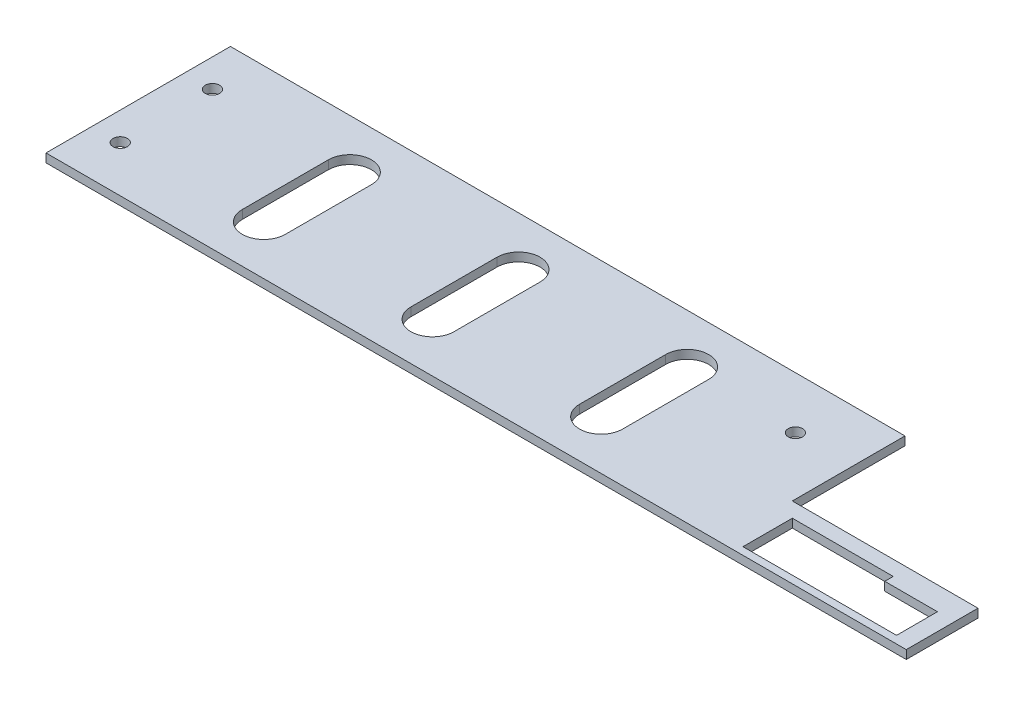
ISO-10303-21;
HEADER;
FILE_DESCRIPTION(('STEP AP214'),'2;1');
FILE_NAME('part.step','',(''),(''),'','','');
FILE_SCHEMA(('AUTOMOTIVE_DESIGN { 1 0 10303 214 1 1 1 1 }'));
ENDSEC;
DATA;
#1=APPLICATION_CONTEXT('core data for automotive mechanical design processes');
#2=APPLICATION_PROTOCOL_DEFINITION('international standard','automotive_design',2000,#1);
#3=PRODUCT_CONTEXT('',#1,'mechanical');
#4=PRODUCT('Part','Part','',(#3));
#5=PRODUCT_RELATED_PRODUCT_CATEGORY('part','',(#4));
#6=PRODUCT_DEFINITION_FORMATION('','',#4);
#7=PRODUCT_DEFINITION_CONTEXT('part definition',#1,'design');
#8=PRODUCT_DEFINITION('design','',#6,#7);
#9=PRODUCT_DEFINITION_SHAPE('','',#8);
#10=(LENGTH_UNIT() NAMED_UNIT(*) SI_UNIT(.MILLI.,.METRE.));
#11=(NAMED_UNIT(*) PLANE_ANGLE_UNIT() SI_UNIT($,.RADIAN.));
#12=(NAMED_UNIT(*) SI_UNIT($,.STERADIAN.) SOLID_ANGLE_UNIT());
#13=UNCERTAINTY_MEASURE_WITH_UNIT(LENGTH_MEASURE(1.E-05),#10,'distance_accuracy_value','');
#14=(GEOMETRIC_REPRESENTATION_CONTEXT(3) GLOBAL_UNCERTAINTY_ASSIGNED_CONTEXT((#13)) GLOBAL_UNIT_ASSIGNED_CONTEXT((#10,
#11,#12)) REPRESENTATION_CONTEXT('',''));
#15=CARTESIAN_POINT('',(0.,0.,0.));
#16=DIRECTION('',(0.,0.,1.));
#17=DIRECTION('',(1.,0.,0.));
#18=AXIS2_PLACEMENT_3D('',#15,#16,#17);
#19=CARTESIAN_POINT('',(0.,3.,0.));
#20=DIRECTION('',(0.,-1.,0.));
#21=DIRECTION('',(0.,0.,-1.));
#22=AXIS2_PLACEMENT_3D('',#19,#20,#21);
#23=PLANE('',#22);
#24=DIRECTION('',(0.,0.,-1.));
#25=VECTOR('',#24,1.);
#26=CARTESIAN_POINT('',(7.64039006229821,3.,-11.6349999999999));
#27=LINE('',#26,#25);
#28=CARTESIAN_POINT('',(7.64039006229821,3.,18.3650000000001));
#29=VERTEX_POINT('',#28);
#30=CARTESIAN_POINT('',(7.64039006229821,3.,-11.6349999999999));
#31=VERTEX_POINT('',#30);
#32=EDGE_CURVE('E220',#29,#31,#27,.T.);
#33=ORIENTED_EDGE('',*,*,#32,.T.);
#34=CARTESIAN_POINT('',(15.1403900622982,3.,-11.6349999999999));
#35=DIRECTION('',(0.,-1.,0.));
#36=DIRECTION('',(0.,0.,-1.));
#37=AXIS2_PLACEMENT_3D('',#34,#35,#36);
#38=CIRCLE('',#37,7.5);
#39=CARTESIAN_POINT('',(22.6403900622982,3.,-11.6349999999999));
#40=VERTEX_POINT('',#39);
#41=EDGE_CURVE('E212',#31,#40,#38,.T.);
#42=ORIENTED_EDGE('',*,*,#41,.T.);
#43=DIRECTION('',(0.,0.,1.));
#44=VECTOR('',#43,1.);
#45=CARTESIAN_POINT('',(22.6403900622982,3.,18.3650000000001));
#46=LINE('',#45,#44);
#47=CARTESIAN_POINT('',(22.6403900622982,3.,18.3650000000001));
#48=VERTEX_POINT('',#47);
#49=EDGE_CURVE('E223',#40,#48,#46,.T.);
#50=ORIENTED_EDGE('',*,*,#49,.T.);
#51=CARTESIAN_POINT('',(15.1403900622982,3.,18.3650000000001));
#52=DIRECTION('',(0.,-1.,0.));
#53=DIRECTION('',(0.,0.,1.));
#54=AXIS2_PLACEMENT_3D('',#51,#52,#53);
#55=CIRCLE('',#54,7.5);
#56=EDGE_CURVE('E56',#48,#29,#55,.T.);
#57=ORIENTED_EDGE('',*,*,#56,.T.);
#58=EDGE_LOOP('',(#33,#42,#50,#57));
#59=FACE_BOUND('',#58,.T.);
#60=DIRECTION('',(0.,0.,-1.));
#61=VECTOR('',#60,1.);
#62=CARTESIAN_POINT('',(-51.1311707902862,3.,-11.6349999999999));
#63=LINE('',#62,#61);
#64=CARTESIAN_POINT('',(-51.1311707902862,3.,18.3650000000001));
#65=VERTEX_POINT('',#64);
#66=CARTESIAN_POINT('',(-51.1311707902862,3.,-11.6349999999999));
#67=VERTEX_POINT('',#66);
#68=EDGE_CURVE('E258',#65,#67,#63,.T.);
#69=ORIENTED_EDGE('',*,*,#68,.T.);
#70=CARTESIAN_POINT('',(-43.6311707902862,3.,-11.6349999999999));
#71=DIRECTION('',(0.,-1.,0.));
#72=DIRECTION('',(0.,0.,-1.));
#73=AXIS2_PLACEMENT_3D('',#70,#71,#72);
#74=CIRCLE('',#73,7.5);
#75=CARTESIAN_POINT('',(-36.1311707902862,3.,-11.6349999999999));
#76=VERTEX_POINT('',#75);
#77=EDGE_CURVE('E249',#67,#76,#74,.T.);
#78=ORIENTED_EDGE('',*,*,#77,.T.);
#79=DIRECTION('',(0.,0.,1.));
#80=VECTOR('',#79,1.);
#81=CARTESIAN_POINT('',(-36.1311707902862,3.,18.3650000000001));
#82=LINE('',#81,#80);
#83=CARTESIAN_POINT('',(-36.1311707902862,3.,18.3650000000001));
#84=VERTEX_POINT('',#83);
#85=EDGE_CURVE('E253',#76,#84,#82,.T.);
#86=ORIENTED_EDGE('',*,*,#85,.T.);
#87=CARTESIAN_POINT('',(-43.6311707902862,3.,18.3650000000001));
#88=DIRECTION('',(0.,-1.,0.));
#89=DIRECTION('',(0.,0.,1.));
#90=AXIS2_PLACEMENT_3D('',#87,#88,#89);
#91=CIRCLE('',#90,7.5);
#92=EDGE_CURVE('E64',#84,#65,#91,.T.);
#93=ORIENTED_EDGE('',*,*,#92,.T.);
#94=EDGE_LOOP('',(#69,#78,#86,#93));
#95=FACE_BOUND('',#94,.T.);
#96=DIRECTION('',(0.,0.,-1.));
#97=VECTOR('',#96,1.);
#98=CARTESIAN_POINT('',(-109.902731642871,3.,-11.6349999999999));
#99=LINE('',#98,#97);
#100=CARTESIAN_POINT('',(-109.902731642871,3.,18.3650000000001));
#101=VERTEX_POINT('',#100);
#102=CARTESIAN_POINT('',(-109.902731642871,3.,-11.6349999999999));
#103=VERTEX_POINT('',#102);
#104=EDGE_CURVE('E293',#101,#103,#99,.T.);
#105=ORIENTED_EDGE('',*,*,#104,.T.);
#106=CARTESIAN_POINT('',(-102.402731642871,3.,-11.6349999999999));
#107=DIRECTION('',(0.,-1.,0.));
#108=DIRECTION('',(0.,0.,-1.));
#109=AXIS2_PLACEMENT_3D('',#106,#107,#108);
#110=CIRCLE('',#109,7.49999999999999);
#111=CARTESIAN_POINT('',(-94.9027316428707,3.,-11.6349999999999));
#112=VERTEX_POINT('',#111);
#113=EDGE_CURVE('E281',#103,#112,#110,.T.);
#114=ORIENTED_EDGE('',*,*,#113,.T.);
#115=DIRECTION('',(0.,0.,1.));
#116=VECTOR('',#115,1.);
#117=CARTESIAN_POINT('',(-94.9027316428707,3.,18.3650000000001));
#118=LINE('',#117,#116);
#119=CARTESIAN_POINT('',(-94.9027316428707,3.,18.3650000000001));
#120=VERTEX_POINT('',#119);
#121=EDGE_CURVE('E285',#112,#120,#118,.T.);
#122=ORIENTED_EDGE('',*,*,#121,.T.);
#123=CARTESIAN_POINT('',(-102.402731642871,3.,18.3650000000001));
#124=DIRECTION('',(0.,-1.,0.));
#125=DIRECTION('',(0.,0.,1.));
#126=AXIS2_PLACEMENT_3D('',#123,#124,#125);
#127=CIRCLE('',#126,7.50000000000002);
#128=EDGE_CURVE('E290',#120,#101,#127,.T.);
#129=ORIENTED_EDGE('',*,*,#128,.T.);
#130=EDGE_LOOP('',(#105,#114,#122,#129));
#131=FACE_BOUND('',#130,.T.);
#132=CARTESIAN_POINT('',(53.8619509149037,3.,-10.635000000012));
#133=DIRECTION('',(0.,1.,0.));
#134=DIRECTION('',(0.,0.,1.));
#135=AXIS2_PLACEMENT_3D('',#132,#133,#134);
#136=CIRCLE('',#135,2.5);
#137=CARTESIAN_POINT('',(53.8619509149037,3.,-8.13500000001199));
#138=VERTEX_POINT('',#137);
#139=EDGE_CURVE('E380',#138,#138,#136,.T.);
#140=ORIENTED_EDGE('',*,*,#139,.F.);
#141=EDGE_LOOP('',(#140));
#142=FACE_BOUND('',#141,.T.);
#143=DIRECTION('',(-1.,0.,0.));
#144=VECTOR('',#143,1.);
#145=CARTESIAN_POINT('',(-161.174292495455,3.,-28.7699999999998));
#146=LINE('',#145,#144);
#147=CARTESIAN_POINT('',(73.9119509148827,3.,-28.7699999999858));
#148=VERTEX_POINT('',#147);
#149=CARTESIAN_POINT('',(-161.174292495455,3.,-28.7699999999998));
#150=VERTEX_POINT('',#149);
#151=EDGE_CURVE('E386',#148,#150,#146,.T.);
#152=ORIENTED_EDGE('',*,*,#151,.T.);
#153=DIRECTION('',(0.,0.,1.));
#154=VECTOR('',#153,1.);
#155=CARTESIAN_POINT('',(-161.174292495455,3.,-28.7699999999998));
#156=LINE('',#155,#154);
#157=CARTESIAN_POINT('',(-161.174292495455,3.,35.5));
#158=VERTEX_POINT('',#157);
#159=EDGE_CURVE('E390',#150,#158,#156,.T.);
#160=ORIENTED_EDGE('',*,*,#159,.T.);
#161=DIRECTION('',(1.,0.,0.));
#162=VECTOR('',#161,1.);
#163=CARTESIAN_POINT('',(-161.174292495455,3.,35.5));
#164=LINE('',#163,#162);
#165=CARTESIAN_POINT('',(138.625707504545,3.,35.5));
#166=VERTEX_POINT('',#165);
#167=EDGE_CURVE('E394',#158,#166,#164,.T.);
#168=ORIENTED_EDGE('',*,*,#167,.T.);
#169=DIRECTION('',(0.,0.,-1.));
#170=VECTOR('',#169,1.);
#171=CARTESIAN_POINT('',(138.625707504545,3.,10.5));
#172=LINE('',#171,#170);
#173=CARTESIAN_POINT('',(138.625707504545,3.,10.5));
#174=VERTEX_POINT('',#173);
#175=EDGE_CURVE('E396',#166,#174,#172,.T.);
#176=ORIENTED_EDGE('',*,*,#175,.T.);
#177=DIRECTION('',(-1.,0.,0.));
#178=VECTOR('',#177,1.);
#179=CARTESIAN_POINT('',(73.9119509148827,3.,10.5));
#180=LINE('',#179,#178);
#181=CARTESIAN_POINT('',(73.9119509148827,3.,10.5));
#182=VERTEX_POINT('',#181);
#183=EDGE_CURVE('E398',#174,#182,#180,.T.);
#184=ORIENTED_EDGE('',*,*,#183,.T.);
#185=DIRECTION('',(0.,0.,-1.));
#186=VECTOR('',#185,1.);
#187=CARTESIAN_POINT('',(73.9119509148827,3.,-28.7699999999858));
#188=LINE('',#187,#186);
#189=EDGE_CURVE('E400',#182,#148,#188,.T.);
#190=ORIENTED_EDGE('',*,*,#189,.T.);
#191=EDGE_LOOP('',(#152,#160,#168,#176,#184,#190));
#192=FACE_BOUND('',#191,.T.);
#193=DIRECTION('',(0.,0.,-1.));
#194=VECTOR('',#193,1.);
#195=CARTESIAN_POINT('',(132.625707504543,3.,18.6342390140619));
#196=LINE('',#195,#194);
#197=CARTESIAN_POINT('',(132.625707504543,3.,32.8870446375442));
#198=VERTEX_POINT('',#197);
#199=CARTESIAN_POINT('',(132.625707504543,3.,18.6342390140619));
#200=VERTEX_POINT('',#199);
#201=EDGE_CURVE('E334',#198,#200,#196,.T.);
#202=ORIENTED_EDGE('',*,*,#201,.F.);
#203=DIRECTION('',(1.,0.,0.));
#204=VECTOR('',#203,1.);
#205=CARTESIAN_POINT('',(114.261515643518,3.,32.8870446375442));
#206=LINE('',#205,#204);
#207=CARTESIAN_POINT('',(79.1091633125255,3.,32.8870446375442));
#208=VERTEX_POINT('',#207);
#209=EDGE_CURVE('E346',#208,#198,#206,.T.);
#210=ORIENTED_EDGE('',*,*,#209,.F.);
#211=DIRECTION('',(0.,0.,1.));
#212=VECTOR('',#211,1.);
#213=CARTESIAN_POINT('',(79.1091633125255,3.,15.6877455438227));
#214=LINE('',#213,#212);
#215=CARTESIAN_POINT('',(79.1091633125255,3.,15.6877455438227));
#216=VERTEX_POINT('',#215);
#217=EDGE_CURVE('E343',#216,#208,#214,.T.);
#218=ORIENTED_EDGE('',*,*,#217,.F.);
#219=DIRECTION('',(-1.,0.,0.));
#220=VECTOR('',#219,1.);
#221=CARTESIAN_POINT('',(114.261515643518,3.,15.6877455438227));
#222=LINE('',#221,#220);
#223=CARTESIAN_POINT('',(114.261515643518,3.,15.6877455438227));
#224=VERTEX_POINT('',#223);
#225=EDGE_CURVE('E341',#224,#216,#222,.T.);
#226=ORIENTED_EDGE('',*,*,#225,.F.);
#227=DIRECTION('',(0.,0.,-1.));
#228=VECTOR('',#227,1.);
#229=CARTESIAN_POINT('',(114.261515643518,3.,15.6877455438227));
#230=LINE('',#229,#228);
#231=CARTESIAN_POINT('',(114.261515643518,3.,18.6342390140619));
#232=VERTEX_POINT('',#231);
#233=EDGE_CURVE('E339',#232,#224,#230,.T.);
#234=ORIENTED_EDGE('',*,*,#233,.F.);
#235=DIRECTION('',(-1.,0.,0.));
#236=VECTOR('',#235,1.);
#237=CARTESIAN_POINT('',(132.625707504543,3.,18.6342390140619));
#238=LINE('',#237,#236);
#239=EDGE_CURVE('E336',#200,#232,#238,.T.);
#240=ORIENTED_EDGE('',*,*,#239,.F.);
#241=EDGE_LOOP('',(#202,#210,#218,#226,#234,#240));
#242=FACE_BOUND('',#241,.T.);
#243=CARTESIAN_POINT('',(-151.374292495455,3.,19.4325000000002));
#244=DIRECTION('',(0.,1.,0.));
#245=DIRECTION('',(0.,0.,1.));
#246=AXIS2_PLACEMENT_3D('',#243,#244,#245);
#247=CIRCLE('',#246,2.5);
#248=CARTESIAN_POINT('',(-151.374292495455,3.,21.9325000000002));
#249=VERTEX_POINT('',#248);
#250=EDGE_CURVE('E328',#249,#249,#247,.T.);
#251=ORIENTED_EDGE('',*,*,#250,.F.);
#252=EDGE_LOOP('',(#251));
#253=FACE_BOUND('',#252,.T.);
#254=CARTESIAN_POINT('',(-151.374292495455,3.,-12.7024999999998));
#255=DIRECTION('',(0.,1.,0.));
#256=DIRECTION('',(0.,0.,1.));
#257=AXIS2_PLACEMENT_3D('',#254,#255,#256);
#258=CIRCLE('',#257,2.5);
#259=CARTESIAN_POINT('',(-151.374292495455,3.,-10.2024999999998));
#260=VERTEX_POINT('',#259);
#261=EDGE_CURVE('E320',#260,#260,#258,.T.);
#262=ORIENTED_EDGE('',*,*,#261,.F.);
#263=EDGE_LOOP('',(#262));
#264=FACE_BOUND('',#263,.T.);
#265=ADVANCED_FACE('F40',(#59,#95,#131,#142,#192,#242,#253,#264),#23,.F.);
#266=CARTESIAN_POINT('',(0.,0.,0.));
#267=DIRECTION('',(0.,-1.,0.));
#268=DIRECTION('',(0.,0.,-1.));
#269=AXIS2_PLACEMENT_3D('',#266,#267,#268);
#270=PLANE('',#269);
#271=CARTESIAN_POINT('',(15.1403900622982,0.,-11.6349999999999));
#272=DIRECTION('',(0.,-1.,0.));
#273=DIRECTION('',(0.,0.,-1.));
#274=AXIS2_PLACEMENT_3D('',#271,#272,#273);
#275=CIRCLE('',#274,7.5);
#276=CARTESIAN_POINT('',(7.64039006229821,0.,-11.6349999999999));
#277=VERTEX_POINT('',#276);
#278=CARTESIAN_POINT('',(22.6403900622982,0.,-11.6349999999999));
#279=VERTEX_POINT('',#278);
#280=EDGE_CURVE('E215',#277,#279,#275,.T.);
#281=ORIENTED_EDGE('',*,*,#280,.F.);
#282=DIRECTION('',(0.,0.,-1.));
#283=VECTOR('',#282,1.);
#284=CARTESIAN_POINT('',(7.64039006229821,0.,-11.6349999999999));
#285=LINE('',#284,#283);
#286=CARTESIAN_POINT('',(7.64039006229821,0.,18.3650000000001));
#287=VERTEX_POINT('',#286);
#288=EDGE_CURVE('E229',#287,#277,#285,.T.);
#289=ORIENTED_EDGE('',*,*,#288,.F.);
#290=CARTESIAN_POINT('',(15.1403900622982,0.,18.3650000000001));
#291=DIRECTION('',(0.,-1.,0.));
#292=DIRECTION('',(0.,0.,1.));
#293=AXIS2_PLACEMENT_3D('',#290,#291,#292);
#294=CIRCLE('',#293,7.5);
#295=CARTESIAN_POINT('',(22.6403900622982,0.,18.3650000000001));
#296=VERTEX_POINT('',#295);
#297=EDGE_CURVE('E232',#296,#287,#294,.T.);
#298=ORIENTED_EDGE('',*,*,#297,.F.);
#299=DIRECTION('',(0.,0.,1.));
#300=VECTOR('',#299,1.);
#301=CARTESIAN_POINT('',(22.6403900622982,0.,18.3650000000001));
#302=LINE('',#301,#300);
#303=EDGE_CURVE('E238',#279,#296,#302,.T.);
#304=ORIENTED_EDGE('',*,*,#303,.F.);
#305=EDGE_LOOP('',(#281,#289,#298,#304));
#306=FACE_BOUND('',#305,.T.);
#307=CARTESIAN_POINT('',(-43.6311707902862,0.,-11.6349999999999));
#308=DIRECTION('',(0.,-1.,0.));
#309=DIRECTION('',(0.,0.,-1.));
#310=AXIS2_PLACEMENT_3D('',#307,#308,#309);
#311=CIRCLE('',#310,7.5);
#312=CARTESIAN_POINT('',(-51.1311707902862,0.,-11.6349999999999));
#313=VERTEX_POINT('',#312);
#314=CARTESIAN_POINT('',(-36.1311707902862,0.,-11.6349999999999));
#315=VERTEX_POINT('',#314);
#316=EDGE_CURVE('E262',#313,#315,#311,.T.);
#317=ORIENTED_EDGE('',*,*,#316,.F.);
#318=DIRECTION('',(0.,0.,-1.));
#319=VECTOR('',#318,1.);
#320=CARTESIAN_POINT('',(-51.1311707902862,0.,-11.6349999999999));
#321=LINE('',#320,#319);
#322=CARTESIAN_POINT('',(-51.1311707902862,0.,18.3650000000001));
#323=VERTEX_POINT('',#322);
#324=EDGE_CURVE('E254',#323,#313,#321,.T.);
#325=ORIENTED_EDGE('',*,*,#324,.F.);
#326=CARTESIAN_POINT('',(-43.6311707902862,0.,18.3650000000001));
#327=DIRECTION('',(0.,-1.,0.));
#328=DIRECTION('',(0.,0.,1.));
#329=AXIS2_PLACEMENT_3D('',#326,#327,#328);
#330=CIRCLE('',#329,7.5);
#331=CARTESIAN_POINT('',(-36.1311707902862,0.,18.3650000000001));
#332=VERTEX_POINT('',#331);
#333=EDGE_CURVE('E269',#332,#323,#330,.T.);
#334=ORIENTED_EDGE('',*,*,#333,.F.);
#335=DIRECTION('',(0.,0.,1.));
#336=VECTOR('',#335,1.);
#337=CARTESIAN_POINT('',(-36.1311707902862,0.,18.3650000000001));
#338=LINE('',#337,#336);
#339=EDGE_CURVE('E265',#315,#332,#338,.T.);
#340=ORIENTED_EDGE('',*,*,#339,.F.);
#341=EDGE_LOOP('',(#317,#325,#334,#340));
#342=FACE_BOUND('',#341,.T.);
#343=CARTESIAN_POINT('',(-102.402731642871,0.,-11.6349999999999));
#344=DIRECTION('',(0.,-1.,0.));
#345=DIRECTION('',(0.,0.,-1.));
#346=AXIS2_PLACEMENT_3D('',#343,#344,#345);
#347=CIRCLE('',#346,7.49999999999999);
#348=CARTESIAN_POINT('',(-109.902731642871,0.,-11.6349999999999));
#349=VERTEX_POINT('',#348);
#350=CARTESIAN_POINT('',(-94.9027316428707,0.,-11.6349999999999));
#351=VERTEX_POINT('',#350);
#352=EDGE_CURVE('E298',#349,#351,#347,.T.);
#353=ORIENTED_EDGE('',*,*,#352,.F.);
#354=DIRECTION('',(0.,0.,-1.));
#355=VECTOR('',#354,1.);
#356=CARTESIAN_POINT('',(-109.902731642871,0.,-11.6349999999999));
#357=LINE('',#356,#355);
#358=CARTESIAN_POINT('',(-109.902731642871,0.,18.3650000000001));
#359=VERTEX_POINT('',#358);
#360=EDGE_CURVE('E286',#359,#349,#357,.T.);
#361=ORIENTED_EDGE('',*,*,#360,.F.);
#362=CARTESIAN_POINT('',(-102.402731642871,0.,18.3650000000001));
#363=DIRECTION('',(0.,-1.,0.));
#364=DIRECTION('',(0.,0.,1.));
#365=AXIS2_PLACEMENT_3D('',#362,#363,#364);
#366=CIRCLE('',#365,7.50000000000002);
#367=CARTESIAN_POINT('',(-94.9027316428707,0.,18.3650000000001));
#368=VERTEX_POINT('',#367);
#369=EDGE_CURVE('E305',#368,#359,#366,.T.);
#370=ORIENTED_EDGE('',*,*,#369,.F.);
#371=DIRECTION('',(0.,0.,1.));
#372=VECTOR('',#371,1.);
#373=CARTESIAN_POINT('',(-94.9027316428707,0.,18.3650000000001));
#374=LINE('',#373,#372);
#375=EDGE_CURVE('E301',#351,#368,#374,.T.);
#376=ORIENTED_EDGE('',*,*,#375,.F.);
#377=EDGE_LOOP('',(#353,#361,#370,#376));
#378=FACE_BOUND('',#377,.T.);
#379=CARTESIAN_POINT('',(-151.374292495455,0.,19.4325000000002));
#380=DIRECTION('',(0.,1.,0.));
#381=DIRECTION('',(0.,0.,1.));
#382=AXIS2_PLACEMENT_3D('',#379,#380,#381);
#383=CIRCLE('',#382,2.5);
#384=CARTESIAN_POINT('',(-151.374292495455,0.,21.9325000000002));
#385=VERTEX_POINT('',#384);
#386=EDGE_CURVE('E324',#385,#385,#383,.T.);
#387=ORIENTED_EDGE('',*,*,#386,.T.);
#388=EDGE_LOOP('',(#387));
#389=FACE_BOUND('',#388,.T.);
#390=DIRECTION('',(-1.,0.,0.));
#391=VECTOR('',#390,1.);
#392=CARTESIAN_POINT('',(-161.174292495455,0.,-28.7699999999998));
#393=LINE('',#392,#391);
#394=CARTESIAN_POINT('',(73.9119509148827,0.,-28.7699999999858));
#395=VERTEX_POINT('',#394);
#396=CARTESIAN_POINT('',(-161.174292495455,0.,-28.7699999999998));
#397=VERTEX_POINT('',#396);
#398=EDGE_CURVE('E383',#395,#397,#393,.T.);
#399=ORIENTED_EDGE('',*,*,#398,.F.);
#400=DIRECTION('',(0.,0.,-1.));
#401=VECTOR('',#400,1.);
#402=CARTESIAN_POINT('',(73.9119509148827,0.,-28.7699999999858));
#403=LINE('',#402,#401);
#404=CARTESIAN_POINT('',(73.9119509148827,0.,10.5));
#405=VERTEX_POINT('',#404);
#406=EDGE_CURVE('E391',#405,#395,#403,.T.);
#407=ORIENTED_EDGE('',*,*,#406,.F.);
#408=DIRECTION('',(-1.,0.,0.));
#409=VECTOR('',#408,1.);
#410=CARTESIAN_POINT('',(73.9119509148827,0.,10.5));
#411=LINE('',#410,#409);
#412=CARTESIAN_POINT('',(138.625707504545,0.,10.5));
#413=VERTEX_POINT('',#412);
#414=EDGE_CURVE('E413',#413,#405,#411,.T.);
#415=ORIENTED_EDGE('',*,*,#414,.F.);
#416=DIRECTION('',(0.,0.,-1.));
#417=VECTOR('',#416,1.);
#418=CARTESIAN_POINT('',(138.625707504545,0.,10.5));
#419=LINE('',#418,#417);
#420=CARTESIAN_POINT('',(138.625707504545,0.,35.5));
#421=VERTEX_POINT('',#420);
#422=EDGE_CURVE('E411',#421,#413,#419,.T.);
#423=ORIENTED_EDGE('',*,*,#422,.F.);
#424=DIRECTION('',(1.,0.,0.));
#425=VECTOR('',#424,1.);
#426=CARTESIAN_POINT('',(-161.174292495455,0.,35.5));
#427=LINE('',#426,#425);
#428=CARTESIAN_POINT('',(-161.174292495455,0.,35.5));
#429=VERTEX_POINT('',#428);
#430=EDGE_CURVE('E409',#429,#421,#427,.T.);
#431=ORIENTED_EDGE('',*,*,#430,.F.);
#432=DIRECTION('',(0.,0.,1.));
#433=VECTOR('',#432,1.);
#434=CARTESIAN_POINT('',(-161.174292495455,0.,25.4999999999999));
#435=LINE('',#434,#433);
#436=EDGE_CURVE('E406',#397,#429,#435,.T.);
#437=ORIENTED_EDGE('',*,*,#436,.F.);
#438=EDGE_LOOP('',(#399,#407,#415,#423,#431,#437));
#439=FACE_BOUND('',#438,.T.);
#440=CARTESIAN_POINT('',(53.8619509149037,0.,-10.635000000012));
#441=DIRECTION('',(0.,1.,0.));
#442=DIRECTION('',(0.,0.,1.));
#443=AXIS2_PLACEMENT_3D('',#440,#441,#442);
#444=CIRCLE('',#443,2.5);
#445=CARTESIAN_POINT('',(53.8619509149037,0.,-8.13500000001199));
#446=VERTEX_POINT('',#445);
#447=EDGE_CURVE('E379',#446,#446,#444,.T.);
#448=ORIENTED_EDGE('',*,*,#447,.T.);
#449=EDGE_LOOP('',(#448));
#450=FACE_BOUND('',#449,.T.);
#451=DIRECTION('',(1.,0.,0.));
#452=VECTOR('',#451,1.);
#453=CARTESIAN_POINT('',(132.625707504543,0.,32.8870446375442));
#454=LINE('',#453,#452);
#455=CARTESIAN_POINT('',(79.1091633125255,0.,32.8870446375442));
#456=VERTEX_POINT('',#455);
#457=CARTESIAN_POINT('',(132.625707504543,0.,32.8870446375442));
#458=VERTEX_POINT('',#457);
#459=EDGE_CURVE('E337',#456,#458,#454,.T.);
#460=ORIENTED_EDGE('',*,*,#459,.T.);
#461=DIRECTION('',(0.,0.,-1.));
#462=VECTOR('',#461,1.);
#463=CARTESIAN_POINT('',(132.625707504543,0.,18.6342390140619));
#464=LINE('',#463,#462);
#465=CARTESIAN_POINT('',(132.625707504543,0.,18.6342390140619));
#466=VERTEX_POINT('',#465);
#467=EDGE_CURVE('E331',#458,#466,#464,.T.);
#468=ORIENTED_EDGE('',*,*,#467,.T.);
#469=DIRECTION('',(-1.,0.,0.));
#470=VECTOR('',#469,1.);
#471=CARTESIAN_POINT('',(132.625707504543,0.,18.6342390140619));
#472=LINE('',#471,#470);
#473=CARTESIAN_POINT('',(114.261515643518,0.,18.6342390140619));
#474=VERTEX_POINT('',#473);
#475=EDGE_CURVE('E351',#466,#474,#472,.T.);
#476=ORIENTED_EDGE('',*,*,#475,.T.);
#477=DIRECTION('',(0.,0.,-1.));
#478=VECTOR('',#477,1.);
#479=CARTESIAN_POINT('',(114.261515643518,0.,15.6877455438227));
#480=LINE('',#479,#478);
#481=CARTESIAN_POINT('',(114.261515643518,0.,15.6877455438227));
#482=VERTEX_POINT('',#481);
#483=EDGE_CURVE('E354',#474,#482,#480,.T.);
#484=ORIENTED_EDGE('',*,*,#483,.T.);
#485=DIRECTION('',(-1.,0.,0.));
#486=VECTOR('',#485,1.);
#487=CARTESIAN_POINT('',(114.261515643518,0.,15.6877455438227));
#488=LINE('',#487,#486);
#489=CARTESIAN_POINT('',(79.1091633125255,0.,15.6877455438227));
#490=VERTEX_POINT('',#489);
#491=EDGE_CURVE('E357',#482,#490,#488,.T.);
#492=ORIENTED_EDGE('',*,*,#491,.T.);
#493=DIRECTION('',(0.,0.,1.));
#494=VECTOR('',#493,1.);
#495=CARTESIAN_POINT('',(79.1091633125255,0.,15.6877455438227));
#496=LINE('',#495,#494);
#497=EDGE_CURVE('E360',#490,#456,#496,.T.);
#498=ORIENTED_EDGE('',*,*,#497,.T.);
#499=EDGE_LOOP('',(#460,#468,#476,#484,#492,#498));
#500=FACE_BOUND('',#499,.T.);
#501=CARTESIAN_POINT('',(-151.374292495455,0.,-12.7024999999998));
#502=DIRECTION('',(0.,1.,0.));
#503=DIRECTION('',(0.,0.,1.));
#504=AXIS2_PLACEMENT_3D('',#501,#502,#503);
#505=CIRCLE('',#504,2.5);
#506=CARTESIAN_POINT('',(-151.374292495455,0.,-10.2024999999998));
#507=VERTEX_POINT('',#506);
#508=EDGE_CURVE('E245',#507,#507,#505,.T.);
#509=ORIENTED_EDGE('',*,*,#508,.T.);
#510=EDGE_LOOP('',(#509));
#511=FACE_BOUND('',#510,.T.);
#512=ADVANCED_FACE('F437',(#306,#342,#378,#389,#439,#450,#500,#511),#270,.T.);
#513=CARTESIAN_POINT('',(-161.174292495455,3.,-28.7699999999998));
#514=DIRECTION('',(0.,0.,1.));
#515=DIRECTION('',(1.,0.,0.));
#516=AXIS2_PLACEMENT_3D('',#513,#514,#515);
#517=PLANE('',#516);
#518=ORIENTED_EDGE('',*,*,#398,.T.);
#519=DIRECTION('',(0.,-1.,0.));
#520=VECTOR('',#519,1.);
#521=CARTESIAN_POINT('',(-161.174292495455,3.,-28.7699999999998));
#522=LINE('',#521,#520);
#523=EDGE_CURVE('E11',#150,#397,#522,.T.);
#524=ORIENTED_EDGE('',*,*,#523,.F.);
#525=ORIENTED_EDGE('',*,*,#151,.F.);
#526=DIRECTION('',(0.,-1.,0.));
#527=VECTOR('',#526,1.);
#528=CARTESIAN_POINT('',(73.9119509148827,3.,-28.7699999999858));
#529=LINE('',#528,#527);
#530=EDGE_CURVE('E402',#148,#395,#529,.T.);
#531=ORIENTED_EDGE('',*,*,#530,.T.);
#532=EDGE_LOOP('',(#518,#524,#525,#531));
#533=FACE_BOUND('',#532,.T.);
#534=ADVANCED_FACE('F42',(#533),#517,.F.);
#535=CARTESIAN_POINT('',(-161.174292495455,3.,25.4999999999999));
#536=DIRECTION('',(1.,0.,0.));
#537=DIRECTION('',(0.,0.,-1.));
#538=AXIS2_PLACEMENT_3D('',#535,#536,#537);
#539=PLANE('',#538);
#540=ORIENTED_EDGE('',*,*,#436,.T.);
#541=DIRECTION('',(0.,-1.,0.));
#542=VECTOR('',#541,1.);
#543=CARTESIAN_POINT('',(-161.174292495455,3.,35.5));
#544=LINE('',#543,#542);
#545=EDGE_CURVE('E49',#158,#429,#544,.T.);
#546=ORIENTED_EDGE('',*,*,#545,.F.);
#547=ORIENTED_EDGE('',*,*,#159,.F.);
#548=ORIENTED_EDGE('',*,*,#523,.T.);
#549=EDGE_LOOP('',(#540,#546,#547,#548));
#550=FACE_BOUND('',#549,.T.);
#551=ADVANCED_FACE('F455',(#550),#539,.F.);
#552=CARTESIAN_POINT('',(-161.174292495455,3.,35.5));
#553=DIRECTION('',(0.,0.,-1.));
#554=DIRECTION('',(-1.,0.,0.));
#555=AXIS2_PLACEMENT_3D('',#552,#553,#554);
#556=PLANE('',#555);
#557=ORIENTED_EDGE('',*,*,#430,.T.);
#558=DIRECTION('',(0.,-1.,0.));
#559=VECTOR('',#558,1.);
#560=CARTESIAN_POINT('',(138.625707504545,3.,35.5));
#561=LINE('',#560,#559);
#562=EDGE_CURVE('E424',#166,#421,#561,.T.);
#563=ORIENTED_EDGE('',*,*,#562,.F.);
#564=ORIENTED_EDGE('',*,*,#167,.F.);
#565=ORIENTED_EDGE('',*,*,#545,.T.);
#566=EDGE_LOOP('',(#557,#563,#564,#565));
#567=FACE_BOUND('',#566,.T.);
#568=ADVANCED_FACE('F431',(#567),#556,.F.);
#569=CARTESIAN_POINT('',(138.625707504545,3.,10.5));
#570=DIRECTION('',(-1.,0.,0.));
#571=DIRECTION('',(0.,0.,1.));
#572=AXIS2_PLACEMENT_3D('',#569,#570,#571);
#573=PLANE('',#572);
#574=ORIENTED_EDGE('',*,*,#422,.T.);
#575=DIRECTION('',(0.,-1.,0.));
#576=VECTOR('',#575,1.);
#577=CARTESIAN_POINT('',(138.625707504545,3.,10.5));
#578=LINE('',#577,#576);
#579=EDGE_CURVE('E421',#174,#413,#578,.T.);
#580=ORIENTED_EDGE('',*,*,#579,.F.);
#581=ORIENTED_EDGE('',*,*,#175,.F.);
#582=ORIENTED_EDGE('',*,*,#562,.T.);
#583=EDGE_LOOP('',(#574,#580,#581,#582));
#584=FACE_BOUND('',#583,.T.);
#585=ADVANCED_FACE('F443',(#584),#573,.F.);
#586=CARTESIAN_POINT('',(73.9119509148827,3.,10.5));
#587=DIRECTION('',(0.,0.,1.));
#588=DIRECTION('',(1.,0.,0.));
#589=AXIS2_PLACEMENT_3D('',#586,#587,#588);
#590=PLANE('',#589);
#591=ORIENTED_EDGE('',*,*,#414,.T.);
#592=DIRECTION('',(0.,-1.,0.));
#593=VECTOR('',#592,1.);
#594=CARTESIAN_POINT('',(73.9119509148827,3.,10.5));
#595=LINE('',#594,#593);
#596=EDGE_CURVE('E418',#182,#405,#595,.T.);
#597=ORIENTED_EDGE('',*,*,#596,.F.);
#598=ORIENTED_EDGE('',*,*,#183,.F.);
#599=ORIENTED_EDGE('',*,*,#579,.T.);
#600=EDGE_LOOP('',(#591,#597,#598,#599));
#601=FACE_BOUND('',#600,.T.);
#602=ADVANCED_FACE('F447',(#601),#590,.F.);
#603=CARTESIAN_POINT('',(73.9119509148827,3.,-28.7699999999858));
#604=DIRECTION('',(-1.,0.,0.));
#605=DIRECTION('',(0.,0.,1.));
#606=AXIS2_PLACEMENT_3D('',#603,#604,#605);
#607=PLANE('',#606);
#608=ORIENTED_EDGE('',*,*,#406,.T.);
#609=ORIENTED_EDGE('',*,*,#530,.F.);
#610=ORIENTED_EDGE('',*,*,#189,.F.);
#611=ORIENTED_EDGE('',*,*,#596,.T.);
#612=EDGE_LOOP('',(#608,#609,#610,#611));
#613=FACE_BOUND('',#612,.T.);
#614=ADVANCED_FACE('F458',(#613),#607,.F.);
#615=CARTESIAN_POINT('',(53.8619509149037,3.,-10.635000000012));
#616=DIRECTION('',(0.,-1.,0.));
#617=DIRECTION('',(0.,0.,-1.));
#618=AXIS2_PLACEMENT_3D('',#615,#616,#617);
#619=CYLINDRICAL_SURFACE('',#618,2.5);
#620=ORIENTED_EDGE('',*,*,#139,.T.);
#621=EDGE_LOOP('',(#620));
#622=FACE_BOUND('',#621,.T.);
#623=ORIENTED_EDGE('',*,*,#447,.F.);
#624=EDGE_LOOP('',(#623));
#625=FACE_BOUND('',#624,.T.);
#626=ADVANCED_FACE('F460',(#622,#625),#619,.F.);
#627=CARTESIAN_POINT('',(132.625707504543,3.,18.6342390140619));
#628=DIRECTION('',(-1.,0.,0.));
#629=DIRECTION('',(0.,0.,1.));
#630=AXIS2_PLACEMENT_3D('',#627,#628,#629);
#631=PLANE('',#630);
#632=ORIENTED_EDGE('',*,*,#467,.F.);
#633=DIRECTION('',(0.,-1.,0.));
#634=VECTOR('',#633,1.);
#635=CARTESIAN_POINT('',(132.625707504543,3.,32.8870446375442));
#636=LINE('',#635,#634);
#637=EDGE_CURVE('E348',#198,#458,#636,.T.);
#638=ORIENTED_EDGE('',*,*,#637,.F.);
#639=ORIENTED_EDGE('',*,*,#201,.T.);
#640=DIRECTION('',(0.,-1.,0.));
#641=VECTOR('',#640,1.);
#642=CARTESIAN_POINT('',(132.625707504543,3.,18.6342390140619));
#643=LINE('',#642,#641);
#644=EDGE_CURVE('E376',#200,#466,#643,.T.);
#645=ORIENTED_EDGE('',*,*,#644,.T.);
#646=EDGE_LOOP('',(#632,#638,#639,#645));
#647=FACE_BOUND('',#646,.T.);
#648=ADVANCED_FACE('F466',(#647),#631,.T.);
#649=CARTESIAN_POINT('',(132.625707504543,3.,18.6342390140619));
#650=DIRECTION('',(0.,0.,1.));
#651=DIRECTION('',(1.,0.,0.));
#652=AXIS2_PLACEMENT_3D('',#649,#650,#651);
#653=PLANE('',#652);
#654=ORIENTED_EDGE('',*,*,#475,.F.);
#655=ORIENTED_EDGE('',*,*,#644,.F.);
#656=ORIENTED_EDGE('',*,*,#239,.T.);
#657=DIRECTION('',(0.,-1.,0.));
#658=VECTOR('',#657,1.);
#659=CARTESIAN_POINT('',(114.261515643518,3.,18.6342390140619));
#660=LINE('',#659,#658);
#661=EDGE_CURVE('E374',#232,#474,#660,.T.);
#662=ORIENTED_EDGE('',*,*,#661,.T.);
#663=EDGE_LOOP('',(#654,#655,#656,#662));
#664=FACE_BOUND('',#663,.T.);
#665=ADVANCED_FACE('F480',(#664),#653,.T.);
#666=CARTESIAN_POINT('',(114.261515643518,3.,15.6877455438227));
#667=DIRECTION('',(-1.,0.,0.));
#668=DIRECTION('',(0.,0.,1.));
#669=AXIS2_PLACEMENT_3D('',#666,#667,#668);
#670=PLANE('',#669);
#671=ORIENTED_EDGE('',*,*,#483,.F.);
#672=ORIENTED_EDGE('',*,*,#661,.F.);
#673=ORIENTED_EDGE('',*,*,#233,.T.);
#674=DIRECTION('',(0.,-1.,0.));
#675=VECTOR('',#674,1.);
#676=CARTESIAN_POINT('',(114.261515643518,3.,15.6877455438227));
#677=LINE('',#676,#675);
#678=EDGE_CURVE('E372',#224,#482,#677,.T.);
#679=ORIENTED_EDGE('',*,*,#678,.T.);
#680=EDGE_LOOP('',(#671,#672,#673,#679));
#681=FACE_BOUND('',#680,.T.);
#682=ADVANCED_FACE('F484',(#681),#670,.T.);
#683=CARTESIAN_POINT('',(114.261515643518,3.,15.6877455438227));
#684=DIRECTION('',(0.,0.,1.));
#685=DIRECTION('',(1.,0.,0.));
#686=AXIS2_PLACEMENT_3D('',#683,#684,#685);
#687=PLANE('',#686);
#688=ORIENTED_EDGE('',*,*,#491,.F.);
#689=ORIENTED_EDGE('',*,*,#678,.F.);
#690=ORIENTED_EDGE('',*,*,#225,.T.);
#691=DIRECTION('',(0.,-1.,0.));
#692=VECTOR('',#691,1.);
#693=CARTESIAN_POINT('',(79.1091633125255,3.,15.6877455438227));
#694=LINE('',#693,#692);
#695=EDGE_CURVE('E370',#216,#490,#694,.T.);
#696=ORIENTED_EDGE('',*,*,#695,.T.);
#697=EDGE_LOOP('',(#688,#689,#690,#696));
#698=FACE_BOUND('',#697,.T.);
#699=ADVANCED_FACE('F488',(#698),#687,.T.);
#700=CARTESIAN_POINT('',(79.1091633125255,3.,15.6877455438227));
#701=DIRECTION('',(1.,0.,0.));
#702=DIRECTION('',(0.,0.,-1.));
#703=AXIS2_PLACEMENT_3D('',#700,#701,#702);
#704=PLANE('',#703);
#705=ORIENTED_EDGE('',*,*,#497,.F.);
#706=ORIENTED_EDGE('',*,*,#695,.F.);
#707=ORIENTED_EDGE('',*,*,#217,.T.);
#708=DIRECTION('',(0.,-1.,0.));
#709=VECTOR('',#708,1.);
#710=CARTESIAN_POINT('',(79.1091633125255,3.,32.8870446375442));
#711=LINE('',#710,#709);
#712=EDGE_CURVE('E367',#208,#456,#711,.T.);
#713=ORIENTED_EDGE('',*,*,#712,.T.);
#714=EDGE_LOOP('',(#705,#706,#707,#713));
#715=FACE_BOUND('',#714,.T.);
#716=ADVANCED_FACE('F492',(#715),#704,.T.);
#717=CARTESIAN_POINT('',(132.625707504543,3.,32.8870446375442));
#718=DIRECTION('',(0.,0.,-1.));
#719=DIRECTION('',(-1.,0.,0.));
#720=AXIS2_PLACEMENT_3D('',#717,#718,#719);
#721=PLANE('',#720);
#722=ORIENTED_EDGE('',*,*,#459,.F.);
#723=ORIENTED_EDGE('',*,*,#712,.F.);
#724=ORIENTED_EDGE('',*,*,#209,.T.);
#725=ORIENTED_EDGE('',*,*,#637,.T.);
#726=EDGE_LOOP('',(#722,#723,#724,#725));
#727=FACE_BOUND('',#726,.T.);
#728=ADVANCED_FACE('F496',(#727),#721,.T.);
#729=CARTESIAN_POINT('',(-151.374292495455,3.,19.4325000000002));
#730=DIRECTION('',(0.,-1.,0.));
#731=DIRECTION('',(0.,0.,-1.));
#732=AXIS2_PLACEMENT_3D('',#729,#730,#731);
#733=CYLINDRICAL_SURFACE('',#732,2.5);
#734=ORIENTED_EDGE('',*,*,#250,.T.);
#735=EDGE_LOOP('',(#734));
#736=FACE_BOUND('',#735,.T.);
#737=ORIENTED_EDGE('',*,*,#386,.F.);
#738=EDGE_LOOP('',(#737));
#739=FACE_BOUND('',#738,.T.);
#740=ADVANCED_FACE('F500',(#736,#739),#733,.F.);
#741=CARTESIAN_POINT('',(-151.374292495455,3.,-12.7024999999998));
#742=DIRECTION('',(0.,-1.,0.));
#743=DIRECTION('',(0.,0.,-1.));
#744=AXIS2_PLACEMENT_3D('',#741,#742,#743);
#745=CYLINDRICAL_SURFACE('',#744,2.5);
#746=ORIENTED_EDGE('',*,*,#261,.T.);
#747=EDGE_LOOP('',(#746));
#748=FACE_BOUND('',#747,.T.);
#749=ORIENTED_EDGE('',*,*,#508,.F.);
#750=EDGE_LOOP('',(#749));
#751=FACE_BOUND('',#750,.T.);
#752=ADVANCED_FACE('F504',(#748,#751),#745,.F.);
#753=CARTESIAN_POINT('',(-102.402731642871,3.,-11.6349999999999));
#754=DIRECTION('',(0.,-1.,0.));
#755=DIRECTION('',(0.,0.,-1.));
#756=AXIS2_PLACEMENT_3D('',#753,#754,#755);
#757=CYLINDRICAL_SURFACE('',#756,7.49999999999999);
#758=ORIENTED_EDGE('',*,*,#352,.T.);
#759=DIRECTION('',(0.,-1.,0.));
#760=VECTOR('',#759,1.);
#761=CARTESIAN_POINT('',(-94.9027316428707,3.,-11.6349999999999));
#762=LINE('',#761,#760);
#763=EDGE_CURVE('E297',#112,#351,#762,.T.);
#764=ORIENTED_EDGE('',*,*,#763,.F.);
#765=ORIENTED_EDGE('',*,*,#113,.F.);
#766=DIRECTION('',(0.,-1.,0.));
#767=VECTOR('',#766,1.);
#768=CARTESIAN_POINT('',(-109.902731642871,3.,-11.6349999999999));
#769=LINE('',#768,#767);
#770=EDGE_CURVE('E266',#103,#349,#769,.T.);
#771=ORIENTED_EDGE('',*,*,#770,.T.);
#772=EDGE_LOOP('',(#758,#764,#765,#771));
#773=FACE_BOUND('',#772,.T.);
#774=ADVANCED_FACE('F508',(#773),#757,.F.);
#775=CARTESIAN_POINT('',(-109.902731642871,3.,-11.6349999999999));
#776=DIRECTION('',(-1.,0.,0.));
#777=DIRECTION('',(0.,0.,1.));
#778=AXIS2_PLACEMENT_3D('',#775,#776,#777);
#779=PLANE('',#778);
#780=ORIENTED_EDGE('',*,*,#360,.T.);
#781=ORIENTED_EDGE('',*,*,#770,.F.);
#782=ORIENTED_EDGE('',*,*,#104,.F.);
#783=DIRECTION('',(0.,-1.,0.));
#784=VECTOR('',#783,1.);
#785=CARTESIAN_POINT('',(-109.902731642871,3.,18.3650000000001));
#786=LINE('',#785,#784);
#787=EDGE_CURVE('E313',#101,#359,#786,.T.);
#788=ORIENTED_EDGE('',*,*,#787,.T.);
#789=EDGE_LOOP('',(#780,#781,#782,#788));
#790=FACE_BOUND('',#789,.T.);
#791=ADVANCED_FACE('F512',(#790),#779,.F.);
#792=CARTESIAN_POINT('',(-102.402731642871,3.,18.3650000000001));
#793=DIRECTION('',(0.,-1.,0.));
#794=DIRECTION('',(0.,0.,-1.));
#795=AXIS2_PLACEMENT_3D('',#792,#793,#794);
#796=CYLINDRICAL_SURFACE('',#795,7.50000000000002);
#797=ORIENTED_EDGE('',*,*,#369,.T.);
#798=ORIENTED_EDGE('',*,*,#787,.F.);
#799=ORIENTED_EDGE('',*,*,#128,.F.);
#800=DIRECTION('',(0.,-1.,0.));
#801=VECTOR('',#800,1.);
#802=CARTESIAN_POINT('',(-94.9027316428707,3.,18.3650000000001));
#803=LINE('',#802,#801);
#804=EDGE_CURVE('E315',#120,#368,#803,.T.);
#805=ORIENTED_EDGE('',*,*,#804,.T.);
#806=EDGE_LOOP('',(#797,#798,#799,#805));
#807=FACE_BOUND('',#806,.T.);
#808=ADVANCED_FACE('F518',(#807),#796,.F.);
#809=CARTESIAN_POINT('',(-94.9027316428707,3.,18.3650000000001));
#810=DIRECTION('',(1.,0.,0.));
#811=DIRECTION('',(0.,0.,-1.));
#812=AXIS2_PLACEMENT_3D('',#809,#810,#811);
#813=PLANE('',#812);
#814=ORIENTED_EDGE('',*,*,#375,.T.);
#815=ORIENTED_EDGE('',*,*,#804,.F.);
#816=ORIENTED_EDGE('',*,*,#121,.F.);
#817=ORIENTED_EDGE('',*,*,#763,.T.);
#818=EDGE_LOOP('',(#814,#815,#816,#817));
#819=FACE_BOUND('',#818,.T.);
#820=ADVANCED_FACE('F514',(#819),#813,.F.);
#821=CARTESIAN_POINT('',(-43.6311707902862,3.,-11.6349999999999));
#822=DIRECTION('',(0.,-1.,0.));
#823=DIRECTION('',(0.,0.,-1.));
#824=AXIS2_PLACEMENT_3D('',#821,#822,#823);
#825=CYLINDRICAL_SURFACE('',#824,7.5);
#826=ORIENTED_EDGE('',*,*,#316,.T.);
#827=DIRECTION('',(0.,-1.,0.));
#828=VECTOR('',#827,1.);
#829=CARTESIAN_POINT('',(-36.1311707902862,3.,-11.6349999999999));
#830=LINE('',#829,#828);
#831=EDGE_CURVE('E261',#76,#315,#830,.T.);
#832=ORIENTED_EDGE('',*,*,#831,.F.);
#833=ORIENTED_EDGE('',*,*,#77,.F.);
#834=DIRECTION('',(0.,-1.,0.));
#835=VECTOR('',#834,1.);
#836=CARTESIAN_POINT('',(-51.1311707902862,3.,-11.6349999999999));
#837=LINE('',#836,#835);
#838=EDGE_CURVE('E239',#67,#313,#837,.T.);
#839=ORIENTED_EDGE('',*,*,#838,.T.);
#840=EDGE_LOOP('',(#826,#832,#833,#839));
#841=FACE_BOUND('',#840,.T.);
#842=ADVANCED_FACE('F517',(#841),#825,.F.);
#843=CARTESIAN_POINT('',(-51.1311707902862,3.,-11.6349999999999));
#844=DIRECTION('',(-1.,0.,0.));
#845=DIRECTION('',(0.,0.,1.));
#846=AXIS2_PLACEMENT_3D('',#843,#844,#845);
#847=PLANE('',#846);
#848=ORIENTED_EDGE('',*,*,#324,.T.);
#849=ORIENTED_EDGE('',*,*,#838,.F.);
#850=ORIENTED_EDGE('',*,*,#68,.F.);
#851=DIRECTION('',(0.,-1.,0.));
#852=VECTOR('',#851,1.);
#853=CARTESIAN_POINT('',(-51.1311707902862,3.,18.3650000000001));
#854=LINE('',#853,#852);
#855=EDGE_CURVE('E275',#65,#323,#854,.T.);
#856=ORIENTED_EDGE('',*,*,#855,.T.);
#857=EDGE_LOOP('',(#848,#849,#850,#856));
#858=FACE_BOUND('',#857,.T.);
#859=ADVANCED_FACE('F528',(#858),#847,.F.);
#860=CARTESIAN_POINT('',(-43.6311707902862,3.,18.3650000000001));
#861=DIRECTION('',(0.,-1.,0.));
#862=DIRECTION('',(0.,0.,-1.));
#863=AXIS2_PLACEMENT_3D('',#860,#861,#862);
#864=CYLINDRICAL_SURFACE('',#863,7.5);
#865=ORIENTED_EDGE('',*,*,#333,.T.);
#866=ORIENTED_EDGE('',*,*,#855,.F.);
#867=ORIENTED_EDGE('',*,*,#92,.F.);
#868=DIRECTION('',(0.,-1.,0.));
#869=VECTOR('',#868,1.);
#870=CARTESIAN_POINT('',(-36.1311707902862,3.,18.3650000000001));
#871=LINE('',#870,#869);
#872=EDGE_CURVE('E277',#84,#332,#871,.T.);
#873=ORIENTED_EDGE('',*,*,#872,.T.);
#874=EDGE_LOOP('',(#865,#866,#867,#873));
#875=FACE_BOUND('',#874,.T.);
#876=ADVANCED_FACE('F533',(#875),#864,.F.);
#877=CARTESIAN_POINT('',(-36.1311707902862,3.,18.3650000000001));
#878=DIRECTION('',(1.,0.,0.));
#879=DIRECTION('',(0.,0.,-1.));
#880=AXIS2_PLACEMENT_3D('',#877,#878,#879);
#881=PLANE('',#880);
#882=ORIENTED_EDGE('',*,*,#339,.T.);
#883=ORIENTED_EDGE('',*,*,#872,.F.);
#884=ORIENTED_EDGE('',*,*,#85,.F.);
#885=ORIENTED_EDGE('',*,*,#831,.T.);
#886=EDGE_LOOP('',(#882,#883,#884,#885));
#887=FACE_BOUND('',#886,.T.);
#888=ADVANCED_FACE('F530',(#887),#881,.F.);
#889=CARTESIAN_POINT('',(15.1403900622982,3.,-11.6349999999999));
#890=DIRECTION('',(0.,-1.,0.));
#891=DIRECTION('',(0.,0.,-1.));
#892=AXIS2_PLACEMENT_3D('',#889,#890,#891);
#893=CYLINDRICAL_SURFACE('',#892,7.5);
#894=ORIENTED_EDGE('',*,*,#280,.T.);
#895=DIRECTION('',(0.,-1.,0.));
#896=VECTOR('',#895,1.);
#897=CARTESIAN_POINT('',(22.6403900622982,3.,-11.6349999999999));
#898=LINE('',#897,#896);
#899=EDGE_CURVE('E208',#40,#279,#898,.T.);
#900=ORIENTED_EDGE('',*,*,#899,.F.);
#901=ORIENTED_EDGE('',*,*,#41,.F.);
#902=DIRECTION('',(0.,-1.,0.));
#903=VECTOR('',#902,1.);
#904=CARTESIAN_POINT('',(7.64039006229821,3.,-11.6349999999999));
#905=LINE('',#904,#903);
#906=EDGE_CURVE('E243',#31,#277,#905,.T.);
#907=ORIENTED_EDGE('',*,*,#906,.T.);
#908=EDGE_LOOP('',(#894,#900,#901,#907));
#909=FACE_BOUND('',#908,.T.);
#910=ADVANCED_FACE('F210',(#909),#893,.F.);
#911=CARTESIAN_POINT('',(7.64039006229821,3.,-11.6349999999999));
#912=DIRECTION('',(-1.,0.,0.));
#913=DIRECTION('',(0.,0.,1.));
#914=AXIS2_PLACEMENT_3D('',#911,#912,#913);
#915=PLANE('',#914);
#916=ORIENTED_EDGE('',*,*,#288,.T.);
#917=ORIENTED_EDGE('',*,*,#906,.F.);
#918=ORIENTED_EDGE('',*,*,#32,.F.);
#919=DIRECTION('',(0.,-1.,0.));
#920=VECTOR('',#919,1.);
#921=CARTESIAN_POINT('',(7.64039006229821,3.,18.3650000000001));
#922=LINE('',#921,#920);
#923=EDGE_CURVE('E246',#29,#287,#922,.T.);
#924=ORIENTED_EDGE('',*,*,#923,.T.);
#925=EDGE_LOOP('',(#916,#917,#918,#924));
#926=FACE_BOUND('',#925,.T.);
#927=ADVANCED_FACE('F542',(#926),#915,.F.);
#928=CARTESIAN_POINT('',(15.1403900622982,3.,18.3650000000001));
#929=DIRECTION('',(0.,-1.,0.));
#930=DIRECTION('',(0.,0.,-1.));
#931=AXIS2_PLACEMENT_3D('',#928,#929,#930);
#932=CYLINDRICAL_SURFACE('',#931,7.5);
#933=ORIENTED_EDGE('',*,*,#297,.T.);
#934=ORIENTED_EDGE('',*,*,#923,.F.);
#935=ORIENTED_EDGE('',*,*,#56,.F.);
#936=DIRECTION('',(0.,-1.,0.));
#937=VECTOR('',#936,1.);
#938=CARTESIAN_POINT('',(22.6403900622982,3.,18.3650000000001));
#939=LINE('',#938,#937);
#940=EDGE_CURVE('E219',#48,#296,#939,.T.);
#941=ORIENTED_EDGE('',*,*,#940,.T.);
#942=EDGE_LOOP('',(#933,#934,#935,#941));
#943=FACE_BOUND('',#942,.T.);
#944=ADVANCED_FACE('F545',(#943),#932,.F.);
#945=CARTESIAN_POINT('',(22.6403900622982,3.,18.3650000000001));
#946=DIRECTION('',(1.,0.,0.));
#947=DIRECTION('',(0.,0.,-1.));
#948=AXIS2_PLACEMENT_3D('',#945,#946,#947);
#949=PLANE('',#948);
#950=ORIENTED_EDGE('',*,*,#303,.T.);
#951=ORIENTED_EDGE('',*,*,#940,.F.);
#952=ORIENTED_EDGE('',*,*,#49,.F.);
#953=ORIENTED_EDGE('',*,*,#899,.T.);
#954=EDGE_LOOP('',(#950,#951,#952,#953));
#955=FACE_BOUND('',#954,.T.);
#956=ADVANCED_FACE('F224',(#955),#949,.F.);
#957=CLOSED_SHELL('',(#265,#512,#534,#551,#568,#585,#602,#614,#626,#648,#665,#682,#699,#716,
#728,#740,#752,#774,#791,#808,#820,#842,#859,#876,#888,#910,#927,#944,#956));
#958=MANIFOLD_SOLID_BREP('B2',#957);
#959=ADVANCED_BREP_SHAPE_REPRESENTATION('',(#18,#958),#14);
#960=SHAPE_DEFINITION_REPRESENTATION(#9,#959);
ENDSEC;
END-ISO-10303-21;
